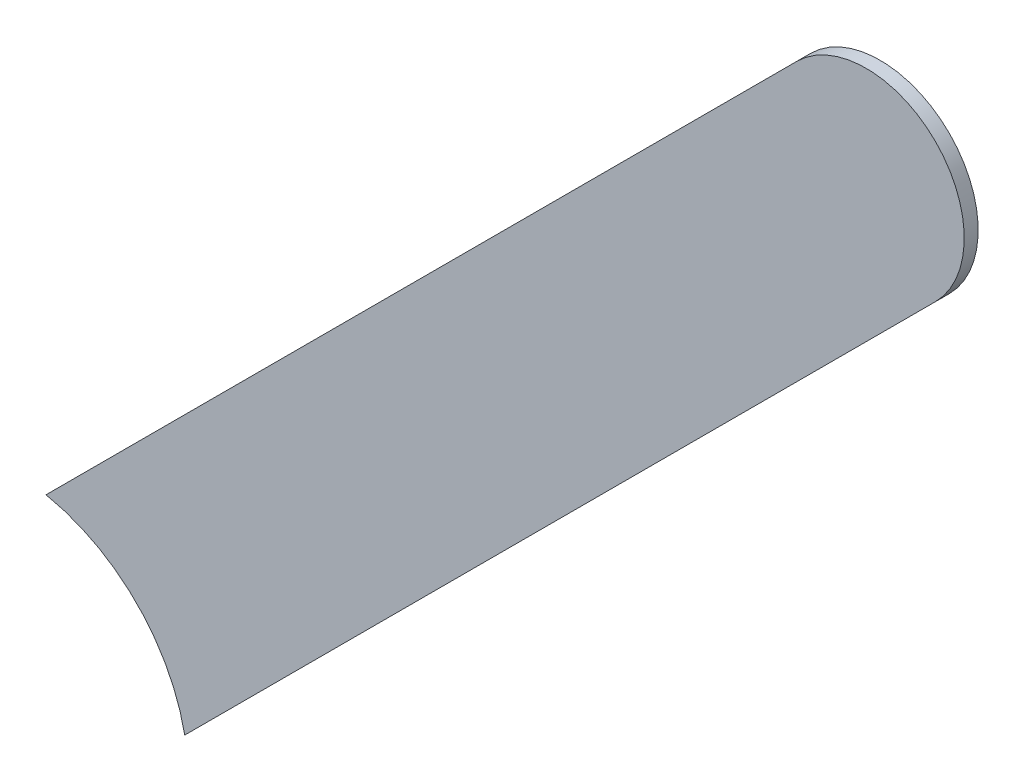
ISO-10303-21;
HEADER;
FILE_DESCRIPTION(('STEP AP214'),'2;1');
FILE_NAME('part.step','',(''),(''),'','','');
FILE_SCHEMA(('AUTOMOTIVE_DESIGN { 1 0 10303 214 1 1 1 1 }'));
ENDSEC;
DATA;
#1=APPLICATION_CONTEXT('core data for automotive mechanical design processes');
#2=APPLICATION_PROTOCOL_DEFINITION('international standard','automotive_design',2000,#1);
#3=PRODUCT_CONTEXT('',#1,'mechanical');
#4=PRODUCT('Part','Part','',(#3));
#5=PRODUCT_RELATED_PRODUCT_CATEGORY('part','',(#4));
#6=PRODUCT_DEFINITION_FORMATION('','',#4);
#7=PRODUCT_DEFINITION_CONTEXT('part definition',#1,'design');
#8=PRODUCT_DEFINITION('design','',#6,#7);
#9=PRODUCT_DEFINITION_SHAPE('','',#8);
#10=(LENGTH_UNIT() NAMED_UNIT(*) SI_UNIT(.MILLI.,.METRE.));
#11=(NAMED_UNIT(*) PLANE_ANGLE_UNIT() SI_UNIT($,.RADIAN.));
#12=(NAMED_UNIT(*) SI_UNIT($,.STERADIAN.) SOLID_ANGLE_UNIT());
#13=UNCERTAINTY_MEASURE_WITH_UNIT(LENGTH_MEASURE(1.E-05),#10,'distance_accuracy_value','');
#14=(GEOMETRIC_REPRESENTATION_CONTEXT(3) GLOBAL_UNCERTAINTY_ASSIGNED_CONTEXT((#13)) GLOBAL_UNIT_ASSIGNED_CONTEXT((#10,
#11,#12)) REPRESENTATION_CONTEXT('',''));
#15=CARTESIAN_POINT('',(0.,0.,0.));
#16=DIRECTION('',(0.,0.,1.));
#17=DIRECTION('',(1.,0.,0.));
#18=AXIS2_PLACEMENT_3D('',#15,#16,#17);
#19=CARTESIAN_POINT('',(34.3413521578357,96.0477971978357,0.));
#20=DIRECTION('',(-0.707106781186549,0.707106781186546,0.));
#21=DIRECTION('',(0.707106781186546,0.707106781186549,0.));
#22=AXIS2_PLACEMENT_3D('',#19,#20,#21);
#23=PLANE('',#22);
#24=DIRECTION('',(0.707106781186546,0.707106781186549,0.));
#25=VECTOR('',#24,1.);
#26=CARTESIAN_POINT('',(34.0767797,95.78322474,0.03556));
#27=LINE('',#26,#25);
#28=CARTESIAN_POINT('',(34.3413521578357,96.0477971978357,0.03556));
#29=VERTEX_POINT('',#28);
#30=CARTESIAN_POINT('',(36.2544233,97.96086834,0.03556));
#31=VERTEX_POINT('',#30);
#32=EDGE_CURVE('E11',#29,#31,#27,.T.);
#33=ORIENTED_EDGE('',*,*,#32,.F.);
#34=DIRECTION('',(0.,0.,1.));
#35=VECTOR('',#34,1.);
#36=CARTESIAN_POINT('',(34.3413521578357,96.0477971978357,0.));
#37=LINE('',#36,#35);
#38=CARTESIAN_POINT('',(34.3413521578357,96.0477971978357,0.));
#39=VERTEX_POINT('',#38);
#40=EDGE_CURVE('E24',#39,#29,#37,.T.);
#41=ORIENTED_EDGE('',*,*,#40,.F.);
#42=DIRECTION('',(0.707106781186546,0.707106781186549,0.));
#43=VECTOR('',#42,1.);
#44=CARTESIAN_POINT('',(34.0767797,95.78322474,0.));
#45=LINE('',#44,#43);
#46=CARTESIAN_POINT('',(36.2544233,97.96086834,0.));
#47=VERTEX_POINT('',#46);
#48=EDGE_CURVE('E75',#39,#47,#45,.T.);
#49=ORIENTED_EDGE('',*,*,#48,.T.);
#50=DIRECTION('',(0.,0.,1.));
#51=VECTOR('',#50,1.);
#52=CARTESIAN_POINT('',(36.2544233,97.96086834,0.));
#53=LINE('',#52,#51);
#54=EDGE_CURVE('E37',#47,#31,#53,.T.);
#55=ORIENTED_EDGE('',*,*,#54,.T.);
#56=EDGE_LOOP('',(#33,#41,#49,#55));
#57=FACE_BOUND('',#56,.T.);
#58=ADVANCED_FACE('F17',(#57),#23,.F.);
#59=CARTESIAN_POINT('',(36.07764692,98.13764472,0.));
#60=DIRECTION('',(0.,0.,-1.));
#61=DIRECTION('',(0.707106781186562,-0.707106781186533,0.));
#62=AXIS2_PLACEMENT_3D('',#59,#60,#61);
#63=CYLINDRICAL_SURFACE('',#62,0.249999554103221);
#64=CARTESIAN_POINT('',(36.07764692,98.13764472,0.03556));
#65=DIRECTION('',(0.,0.,1.));
#66=DIRECTION('',(0.707106781186562,-0.707106781186533,0.));
#67=AXIS2_PLACEMENT_3D('',#64,#65,#66);
#68=CIRCLE('',#67,0.249999554103221);
#69=CARTESIAN_POINT('',(35.90087054,98.3144211,0.03556));
#70=VERTEX_POINT('',#69);
#71=EDGE_CURVE('E83',#31,#70,#68,.T.);
#72=ORIENTED_EDGE('',*,*,#71,.F.);
#73=ORIENTED_EDGE('',*,*,#54,.F.);
#74=CARTESIAN_POINT('',(36.07764692,98.13764472,0.));
#75=DIRECTION('',(0.,0.,1.));
#76=DIRECTION('',(0.707106781186562,-0.707106781186533,0.));
#77=AXIS2_PLACEMENT_3D('',#74,#75,#76);
#78=CIRCLE('',#77,0.249999554103221);
#79=CARTESIAN_POINT('',(35.90087054,98.3144211,0.));
#80=VERTEX_POINT('',#79);
#81=EDGE_CURVE('E81',#47,#80,#78,.T.);
#82=ORIENTED_EDGE('',*,*,#81,.T.);
#83=DIRECTION('',(0.,0.,1.));
#84=VECTOR('',#83,1.);
#85=CARTESIAN_POINT('',(35.90087054,98.3144211,0.));
#86=LINE('',#85,#84);
#87=EDGE_CURVE('E67',#80,#70,#86,.T.);
#88=ORIENTED_EDGE('',*,*,#87,.T.);
#89=EDGE_LOOP('',(#72,#73,#82,#88));
#90=FACE_BOUND('',#89,.T.);
#91=ADVANCED_FACE('F89',(#90),#63,.T.);
#92=CARTESIAN_POINT('',(35.90087054,98.3144211,0.));
#93=DIRECTION('',(0.707106781186549,-0.707106781186546,0.));
#94=DIRECTION('',(-0.707106781186546,-0.707106781186549,0.));
#95=AXIS2_PLACEMENT_3D('',#92,#93,#94);
#96=PLANE('',#95);
#97=DIRECTION('',(-0.707106781186546,-0.707106781186549,0.));
#98=VECTOR('',#97,1.);
#99=CARTESIAN_POINT('',(35.90087054,98.3144211,0.03556));
#100=LINE('',#99,#98);
#101=CARTESIAN_POINT('',(33.9878010949451,96.4013516549451,0.03556));
#102=VERTEX_POINT('',#101);
#103=EDGE_CURVE('E71',#70,#102,#100,.T.);
#104=ORIENTED_EDGE('',*,*,#103,.F.);
#105=ORIENTED_EDGE('',*,*,#87,.F.);
#106=DIRECTION('',(-0.707106781186546,-0.707106781186549,0.));
#107=VECTOR('',#106,1.);
#108=CARTESIAN_POINT('',(35.90087054,98.3144211,0.));
#109=LINE('',#108,#107);
#110=CARTESIAN_POINT('',(33.9878010949451,96.4013516549451,0.));
#111=VERTEX_POINT('',#110);
#112=EDGE_CURVE('E63',#80,#111,#109,.T.);
#113=ORIENTED_EDGE('',*,*,#112,.T.);
#114=DIRECTION('',(0.,0.,1.));
#115=VECTOR('',#114,1.);
#116=CARTESIAN_POINT('',(33.9878010949451,96.4013516549451,0.));
#117=LINE('',#116,#115);
#118=EDGE_CURVE('E53',#111,#102,#117,.T.);
#119=ORIENTED_EDGE('',*,*,#118,.T.);
#120=EDGE_LOOP('',(#104,#105,#113,#119));
#121=FACE_BOUND('',#120,.T.);
#122=ADVANCED_FACE('F66',(#121),#96,.F.);
#123=CARTESIAN_POINT('',(33.90000078,95.96000112,0.));
#124=DIRECTION('',(0.,0.,-1.));
#125=DIRECTION('',(1.,0.,0.));
#126=AXIS2_PLACEMENT_3D('',#123,#124,#125);
#127=CYLINDRICAL_SURFACE('',#126,0.4499991);
#128=ORIENTED_EDGE('',*,*,#40,.T.);
#129=CARTESIAN_POINT('',(33.90000078,95.96000112,0.03556));
#130=DIRECTION('',(0.,0.,1.));
#131=DIRECTION('',(1.,0.,0.));
#132=AXIS2_PLACEMENT_3D('',#129,#130,#131);
#133=CIRCLE('',#132,0.4499991);
#134=EDGE_CURVE('E59',#29,#102,#133,.T.);
#135=ORIENTED_EDGE('',*,*,#134,.T.);
#136=ORIENTED_EDGE('',*,*,#118,.F.);
#137=CARTESIAN_POINT('',(33.90000078,95.96000112,0.));
#138=DIRECTION('',(0.,0.,1.));
#139=DIRECTION('',(1.,0.,0.));
#140=AXIS2_PLACEMENT_3D('',#137,#138,#139);
#141=CIRCLE('',#140,0.4499991);
#142=EDGE_CURVE('E57',#39,#111,#141,.T.);
#143=ORIENTED_EDGE('',*,*,#142,.F.);
#144=EDGE_LOOP('',(#128,#135,#136,#143));
#145=FACE_BOUND('',#144,.T.);
#146=ADVANCED_FACE('F55',(#145),#127,.F.);
#147=CARTESIAN_POINT('',(34.0767797,95.78322474,0.));
#148=DIRECTION('',(0.,0.,-1.));
#149=DIRECTION('',(-1.,0.,0.));
#150=AXIS2_PLACEMENT_3D('',#147,#148,#149);
#151=PLANE('',#150);
#152=ORIENTED_EDGE('',*,*,#48,.F.);
#153=ORIENTED_EDGE('',*,*,#142,.T.);
#154=ORIENTED_EDGE('',*,*,#112,.F.);
#155=ORIENTED_EDGE('',*,*,#81,.F.);
#156=EDGE_LOOP('',(#152,#153,#154,#155));
#157=FACE_BOUND('',#156,.T.);
#158=ADVANCED_FACE('F74',(#157),#151,.T.);
#159=CARTESIAN_POINT('',(34.0767797,95.78322474,0.03556));
#160=DIRECTION('',(0.,0.,-1.));
#161=DIRECTION('',(-1.,0.,0.));
#162=AXIS2_PLACEMENT_3D('',#159,#160,#161);
#163=PLANE('',#162);
#164=ORIENTED_EDGE('',*,*,#134,.F.);
#165=ORIENTED_EDGE('',*,*,#32,.T.);
#166=ORIENTED_EDGE('',*,*,#71,.T.);
#167=ORIENTED_EDGE('',*,*,#103,.T.);
#168=EDGE_LOOP('',(#164,#165,#166,#167));
#169=FACE_BOUND('',#168,.T.);
#170=ADVANCED_FACE('F91',(#169),#163,.F.);
#171=CLOSED_SHELL('',(#58,#91,#122,#146,#158,#170));
#172=MANIFOLD_SOLID_BREP('B1',#171);
#173=ADVANCED_BREP_SHAPE_REPRESENTATION('',(#18,#172),#14);
#174=SHAPE_DEFINITION_REPRESENTATION(#9,#173);
ENDSEC;
END-ISO-10303-21;
